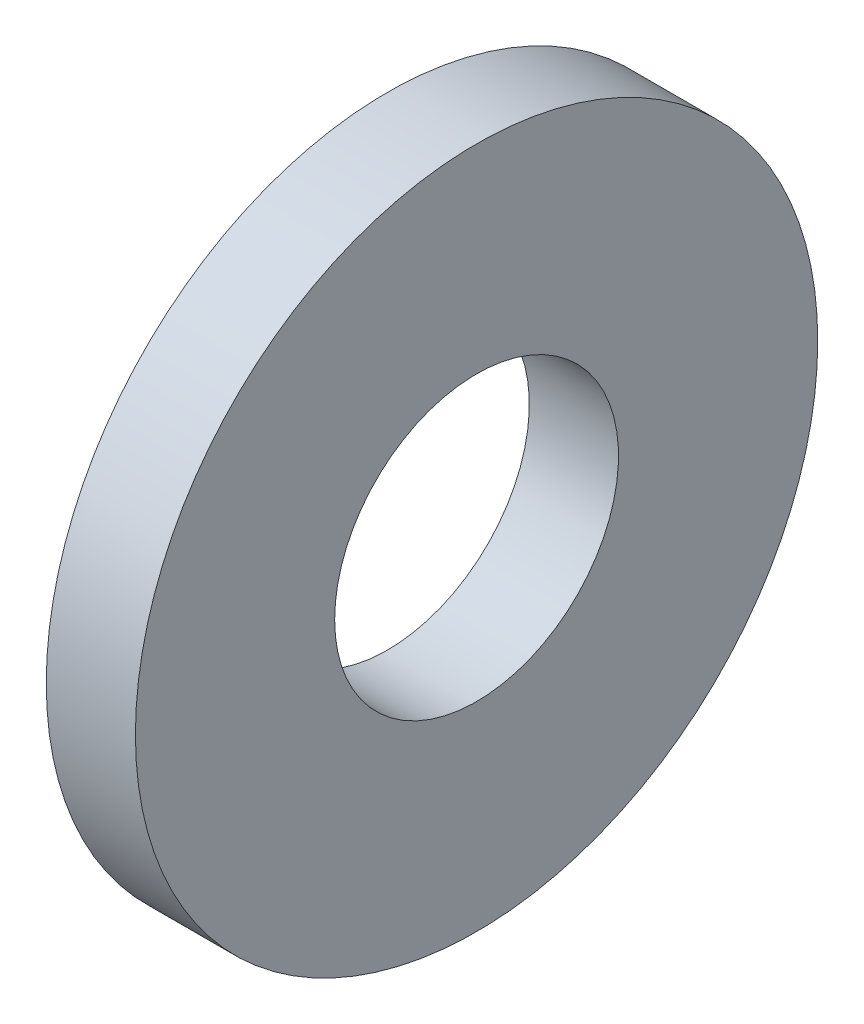
ISO-10303-21;
HEADER;
FILE_DESCRIPTION(('STEP AP214'),'2;1');
FILE_NAME('part.step','',(''),(''),'','','');
FILE_SCHEMA(('AUTOMOTIVE_DESIGN { 1 0 10303 214 1 1 1 1 }'));
ENDSEC;
DATA;
#1=APPLICATION_CONTEXT('core data for automotive mechanical design processes');
#2=APPLICATION_PROTOCOL_DEFINITION('international standard','automotive_design',2000,#1);
#3=PRODUCT_CONTEXT('',#1,'mechanical');
#4=PRODUCT('Part','Part','',(#3));
#5=PRODUCT_RELATED_PRODUCT_CATEGORY('part','',(#4));
#6=PRODUCT_DEFINITION_FORMATION('','',#4);
#7=PRODUCT_DEFINITION_CONTEXT('part definition',#1,'design');
#8=PRODUCT_DEFINITION('design','',#6,#7);
#9=PRODUCT_DEFINITION_SHAPE('','',#8);
#10=(LENGTH_UNIT() NAMED_UNIT(*) SI_UNIT(.MILLI.,.METRE.));
#11=(NAMED_UNIT(*) PLANE_ANGLE_UNIT() SI_UNIT($,.RADIAN.));
#12=(NAMED_UNIT(*) SI_UNIT($,.STERADIAN.) SOLID_ANGLE_UNIT());
#13=UNCERTAINTY_MEASURE_WITH_UNIT(LENGTH_MEASURE(1.E-05),#10,'distance_accuracy_value','');
#14=(GEOMETRIC_REPRESENTATION_CONTEXT(3) GLOBAL_UNCERTAINTY_ASSIGNED_CONTEXT((#13)) GLOBAL_UNIT_ASSIGNED_CONTEXT((#10,
#11,#12)) REPRESENTATION_CONTEXT('',''));
#15=CARTESIAN_POINT('',(0.,0.,0.));
#16=DIRECTION('',(0.,0.,1.));
#17=DIRECTION('',(1.,0.,0.));
#18=AXIS2_PLACEMENT_3D('',#15,#16,#17);
#19=CARTESIAN_POINT('',(-34.9249999999999,0.,0.));
#20=DIRECTION('',(-1.,0.,0.));
#21=DIRECTION('',(0.,0.,1.));
#22=AXIS2_PLACEMENT_3D('',#19,#20,#21);
#23=CYLINDRICAL_SURFACE('',#22,1.9812);
#24=CARTESIAN_POINT('',(0.,0.,0.));
#25=DIRECTION('',(-1.,0.,0.));
#26=DIRECTION('',(0.,0.,1.));
#27=AXIS2_PLACEMENT_3D('',#24,#25,#26);
#28=CIRCLE('',#27,1.9812);
#29=CARTESIAN_POINT('',(0.,0.,1.9812));
#30=VERTEX_POINT('',#29);
#31=EDGE_CURVE('E10',#30,#30,#28,.T.);
#32=ORIENTED_EDGE('',*,*,#31,.F.);
#33=EDGE_LOOP('',(#32));
#34=FACE_BOUND('',#33,.T.);
#35=CARTESIAN_POINT('',(-1.2446,0.,0.));
#36=DIRECTION('',(-1.,0.,0.));
#37=DIRECTION('',(0.,0.,1.));
#38=AXIS2_PLACEMENT_3D('',#35,#36,#37);
#39=CIRCLE('',#38,1.9812);
#40=CARTESIAN_POINT('',(-1.2446,0.,1.9812));
#41=VERTEX_POINT('',#40);
#42=EDGE_CURVE('E45',#41,#41,#39,.T.);
#43=ORIENTED_EDGE('',*,*,#42,.T.);
#44=EDGE_LOOP('',(#43));
#45=FACE_BOUND('',#44,.T.);
#46=ADVANCED_FACE('F31',(#34,#45),#23,.F.);
#47=CARTESIAN_POINT('',(0.,1.9812,0.));
#48=DIRECTION('',(-1.,0.,0.));
#49=DIRECTION('',(0.,0.,1.));
#50=AXIS2_PLACEMENT_3D('',#47,#48,#49);
#51=PLANE('',#50);
#52=CARTESIAN_POINT('',(0.,0.,0.));
#53=DIRECTION('',(-1.,0.,0.));
#54=DIRECTION('',(0.,0.,1.));
#55=AXIS2_PLACEMENT_3D('',#52,#53,#54);
#56=CIRCLE('',#55,4.7625);
#57=CARTESIAN_POINT('',(0.,0.,4.7625));
#58=VERTEX_POINT('',#57);
#59=EDGE_CURVE('E37',#58,#58,#56,.T.);
#60=ORIENTED_EDGE('',*,*,#59,.F.);
#61=EDGE_LOOP('',(#60));
#62=FACE_BOUND('',#61,.T.);
#63=ORIENTED_EDGE('',*,*,#31,.T.);
#64=EDGE_LOOP('',(#63));
#65=FACE_BOUND('',#64,.T.);
#66=ADVANCED_FACE('F60',(#62,#65),#51,.F.);
#67=CARTESIAN_POINT('',(-34.9249999999999,0.,0.));
#68=DIRECTION('',(-1.,0.,0.));
#69=DIRECTION('',(0.,0.,1.));
#70=AXIS2_PLACEMENT_3D('',#67,#68,#69);
#71=CYLINDRICAL_SURFACE('',#70,4.7625);
#72=CARTESIAN_POINT('',(-1.2446,0.,0.));
#73=DIRECTION('',(-1.,0.,0.));
#74=DIRECTION('',(0.,0.,1.));
#75=AXIS2_PLACEMENT_3D('',#72,#73,#74);
#76=CIRCLE('',#75,4.7625);
#77=CARTESIAN_POINT('',(-1.2446,0.,4.7625));
#78=VERTEX_POINT('',#77);
#79=EDGE_CURVE('E41',#78,#78,#76,.T.);
#80=ORIENTED_EDGE('',*,*,#79,.F.);
#81=EDGE_LOOP('',(#80));
#82=FACE_BOUND('',#81,.T.);
#83=ORIENTED_EDGE('',*,*,#59,.T.);
#84=EDGE_LOOP('',(#83));
#85=FACE_BOUND('',#84,.T.);
#86=ADVANCED_FACE('F55',(#82,#85),#71,.T.);
#87=CARTESIAN_POINT('',(-1.2446,4.7625,0.));
#88=DIRECTION('',(1.,0.,0.));
#89=DIRECTION('',(0.,0.,-1.));
#90=AXIS2_PLACEMENT_3D('',#87,#88,#89);
#91=PLANE('',#90);
#92=ORIENTED_EDGE('',*,*,#42,.F.);
#93=EDGE_LOOP('',(#92));
#94=FACE_BOUND('',#93,.T.);
#95=ORIENTED_EDGE('',*,*,#79,.T.);
#96=EDGE_LOOP('',(#95));
#97=FACE_BOUND('',#96,.T.);
#98=ADVANCED_FACE('F52',(#94,#97),#91,.F.);
#99=CLOSED_SHELL('',(#46,#66,#86,#98));
#100=MANIFOLD_SOLID_BREP('B2',#99);
#101=ADVANCED_BREP_SHAPE_REPRESENTATION('',(#18,#100),#14);
#102=SHAPE_DEFINITION_REPRESENTATION(#9,#101);
ENDSEC;
END-ISO-10303-21;
